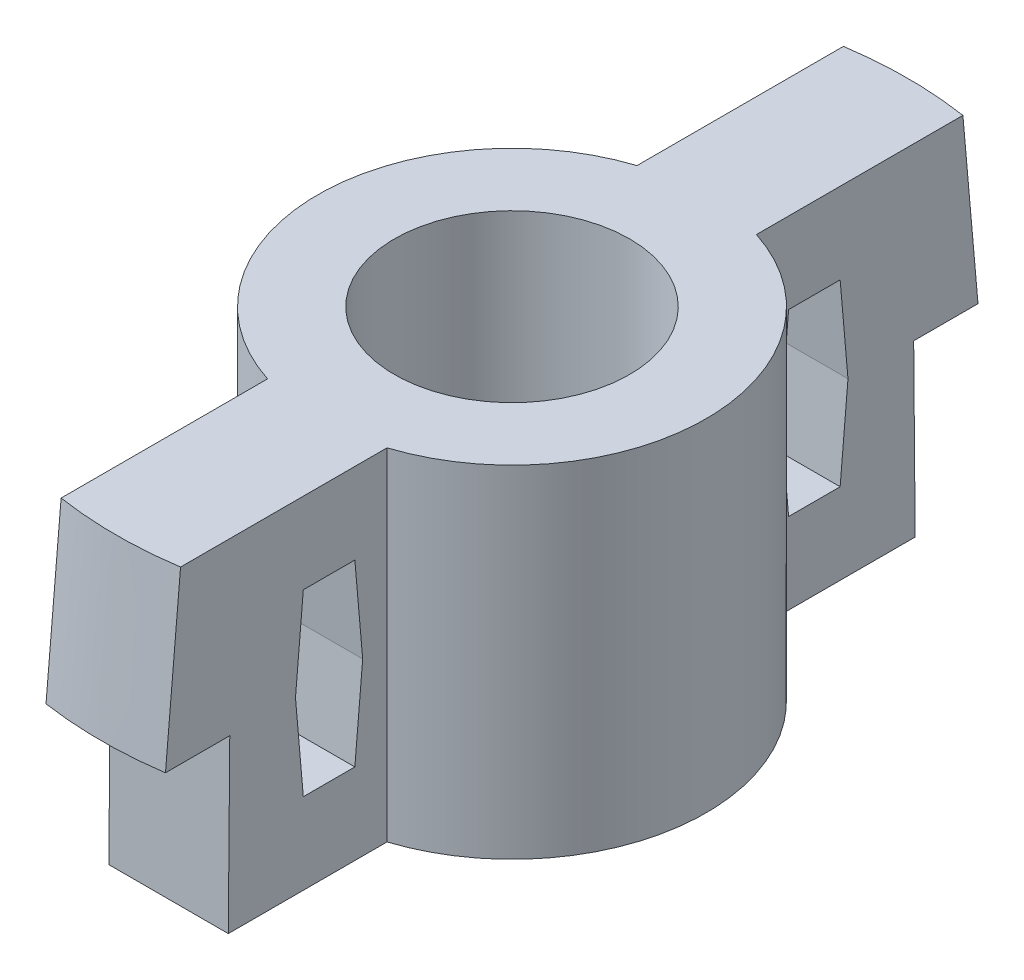
ISO-10303-21;
HEADER;
FILE_DESCRIPTION(('STEP AP214'),'2;1');
FILE_NAME('part.step','',(''),(''),'','','');
FILE_SCHEMA(('AUTOMOTIVE_DESIGN { 1 0 10303 214 1 1 1 1 }'));
ENDSEC;
DATA;
#1=APPLICATION_CONTEXT('core data for automotive mechanical design processes');
#2=APPLICATION_PROTOCOL_DEFINITION('international standard','automotive_design',2000,#1);
#3=PRODUCT_CONTEXT('',#1,'mechanical');
#4=PRODUCT('Part','Part','',(#3));
#5=PRODUCT_RELATED_PRODUCT_CATEGORY('part','',(#4));
#6=PRODUCT_DEFINITION_FORMATION('','',#4);
#7=PRODUCT_DEFINITION_CONTEXT('part definition',#1,'design');
#8=PRODUCT_DEFINITION('design','',#6,#7);
#9=PRODUCT_DEFINITION_SHAPE('','',#8);
#10=(LENGTH_UNIT() NAMED_UNIT(*) SI_UNIT(.MILLI.,.METRE.));
#11=(NAMED_UNIT(*) PLANE_ANGLE_UNIT() SI_UNIT($,.RADIAN.));
#12=(NAMED_UNIT(*) SI_UNIT($,.STERADIAN.) SOLID_ANGLE_UNIT());
#13=UNCERTAINTY_MEASURE_WITH_UNIT(LENGTH_MEASURE(1.E-05),#10,'distance_accuracy_value','');
#14=(GEOMETRIC_REPRESENTATION_CONTEXT(3) GLOBAL_UNCERTAINTY_ASSIGNED_CONTEXT((#13)) GLOBAL_UNIT_ASSIGNED_CONTEXT((#10,
#11,#12)) REPRESENTATION_CONTEXT('',''));
#15=CARTESIAN_POINT('',(0.,0.,0.));
#16=DIRECTION('',(0.,0.,1.));
#17=DIRECTION('',(1.,0.,0.));
#18=AXIS2_PLACEMENT_3D('',#15,#16,#17);
#19=CARTESIAN_POINT('',(-2.6,1.2,-2.90498639623111));
#20=DIRECTION('',(0.,1.,0.));
#21=DIRECTION('',(0.,0.,1.));
#22=AXIS2_PLACEMENT_3D('',#19,#20,#21);
#23=PLANE('',#22);
#24=DIRECTION('',(1.,0.,0.));
#25=VECTOR('',#24,1.);
#26=CARTESIAN_POINT('',(-2.6,1.2,-2.90498639623111));
#27=LINE('',#26,#25);
#28=CARTESIAN_POINT('',(0.800000000000001,1.2,-2.90498639623111));
#29=VERTEX_POINT('',#28);
#30=CARTESIAN_POINT('',(-0.799999999999999,1.2,-2.90498639623111));
#31=VERTEX_POINT('',#30);
#32=EDGE_CURVE('E179',#29,#31,#27,.F.);
#33=ORIENTED_EDGE('',*,*,#32,.T.);
#34=DIRECTION('',(0.,0.,1.));
#35=VECTOR('',#34,1.);
#36=CARTESIAN_POINT('',(-0.799999999999999,1.2,-2.90498639623111));
#37=LINE('',#36,#35);
#38=CARTESIAN_POINT('',(-0.799999999999999,1.2,-3.59501360376889));
#39=VERTEX_POINT('',#38);
#40=EDGE_CURVE('E174',#39,#31,#37,.T.);
#41=ORIENTED_EDGE('',*,*,#40,.F.);
#42=DIRECTION('',(1.,0.,0.));
#43=VECTOR('',#42,1.);
#44=CARTESIAN_POINT('',(-2.6,1.2,-3.59501360376889));
#45=LINE('',#44,#43);
#46=CARTESIAN_POINT('',(0.800000000000003,1.2,-3.59501360376889));
#47=VERTEX_POINT('',#46);
#48=EDGE_CURVE('E176',#39,#47,#45,.T.);
#49=ORIENTED_EDGE('',*,*,#48,.T.);
#50=DIRECTION('',(0.,0.,-1.));
#51=VECTOR('',#50,1.);
#52=CARTESIAN_POINT('',(0.800000000000001,1.2,-5.44150714416512));
#53=LINE('',#52,#51);
#54=EDGE_CURVE('E252',#29,#47,#53,.T.);
#55=ORIENTED_EDGE('',*,*,#54,.F.);
#56=EDGE_LOOP('',(#33,#41,#49,#55));
#57=FACE_BOUND('',#56,.T.);
#58=ADVANCED_FACE('F16',(#57),#23,.F.);
#59=CARTESIAN_POINT('',(-2.6,-1.2,-2.90498639623111));
#60=DIRECTION('',(0.,-1.,0.));
#61=DIRECTION('',(0.,0.,-1.));
#62=AXIS2_PLACEMENT_3D('',#59,#60,#61);
#63=PLANE('',#62);
#64=DIRECTION('',(1.,0.,0.));
#65=VECTOR('',#64,1.);
#66=CARTESIAN_POINT('',(-2.6,-1.2,-3.59501360376889));
#67=LINE('',#66,#65);
#68=CARTESIAN_POINT('',(0.800000000000002,-1.2,-3.59501360376889));
#69=VERTEX_POINT('',#68);
#70=CARTESIAN_POINT('',(-0.799999999999999,-1.2,-3.59501360376889));
#71=VERTEX_POINT('',#70);
#72=EDGE_CURVE('E220',#69,#71,#67,.F.);
#73=ORIENTED_EDGE('',*,*,#72,.T.);
#74=DIRECTION('',(0.,0.,-1.));
#75=VECTOR('',#74,1.);
#76=CARTESIAN_POINT('',(-0.799999999999999,-1.2,-2.90498639623111));
#77=LINE('',#76,#75);
#78=CARTESIAN_POINT('',(-0.799999999999999,-1.2,-2.90498639623111));
#79=VERTEX_POINT('',#78);
#80=EDGE_CURVE('E184',#79,#71,#77,.T.);
#81=ORIENTED_EDGE('',*,*,#80,.F.);
#82=DIRECTION('',(1.,0.,0.));
#83=VECTOR('',#82,1.);
#84=CARTESIAN_POINT('',(-2.6,-1.2,-2.90498639623111));
#85=LINE('',#84,#83);
#86=CARTESIAN_POINT('',(0.800000000000001,-1.2,-2.90498639623111));
#87=VERTEX_POINT('',#86);
#88=EDGE_CURVE('E225',#79,#87,#85,.T.);
#89=ORIENTED_EDGE('',*,*,#88,.T.);
#90=DIRECTION('',(0.,0.,-1.));
#91=VECTOR('',#90,1.);
#92=CARTESIAN_POINT('',(0.800000000000001,-1.2,-2.90498639623111));
#93=LINE('',#92,#91);
#94=EDGE_CURVE('E278',#69,#87,#93,.F.);
#95=ORIENTED_EDGE('',*,*,#94,.F.);
#96=EDGE_LOOP('',(#73,#81,#89,#95));
#97=FACE_BOUND('',#96,.T.);
#98=ADVANCED_FACE('F651',(#97),#63,.F.);
#99=CARTESIAN_POINT('',(-2.6,-1.2,2.90498639623111));
#100=DIRECTION('',(0.,-1.,0.));
#101=DIRECTION('',(0.,0.,-1.));
#102=AXIS2_PLACEMENT_3D('',#99,#100,#101);
#103=PLANE('',#102);
#104=DIRECTION('',(1.,0.,0.));
#105=VECTOR('',#104,1.);
#106=CARTESIAN_POINT('',(-2.6,-1.2,3.59501360376889));
#107=LINE('',#106,#105);
#108=CARTESIAN_POINT('',(-0.799999999999999,-1.2,3.59501360376889));
#109=VERTEX_POINT('',#108);
#110=CARTESIAN_POINT('',(0.800000000000001,-1.2,3.59501360376889));
#111=VERTEX_POINT('',#110);
#112=EDGE_CURVE('E260',#109,#111,#107,.T.);
#113=ORIENTED_EDGE('',*,*,#112,.T.);
#114=DIRECTION('',(0.,0.,-1.));
#115=VECTOR('',#114,1.);
#116=CARTESIAN_POINT('',(0.800000000000001,-1.2,2.4738633753706));
#117=LINE('',#116,#115);
#118=CARTESIAN_POINT('',(0.800000000000001,-1.2,2.90498639623111));
#119=VERTEX_POINT('',#118);
#120=EDGE_CURVE('E270',#119,#111,#117,.F.);
#121=ORIENTED_EDGE('',*,*,#120,.F.);
#122=DIRECTION('',(1.,0.,0.));
#123=VECTOR('',#122,1.);
#124=CARTESIAN_POINT('',(-2.6,-1.2,2.90498639623111));
#125=LINE('',#124,#123);
#126=CARTESIAN_POINT('',(-0.799999999999998,-1.2,2.90498639623111));
#127=VERTEX_POINT('',#126);
#128=EDGE_CURVE('E294',#119,#127,#125,.F.);
#129=ORIENTED_EDGE('',*,*,#128,.T.);
#130=DIRECTION('',(0.,0.,-1.));
#131=VECTOR('',#130,1.);
#132=CARTESIAN_POINT('',(-0.799999999999999,-1.2,2.90498639623111));
#133=LINE('',#132,#131);
#134=EDGE_CURVE('E256',#109,#127,#133,.T.);
#135=ORIENTED_EDGE('',*,*,#134,.F.);
#136=EDGE_LOOP('',(#113,#121,#129,#135));
#137=FACE_BOUND('',#136,.T.);
#138=ADVANCED_FACE('F604',(#137),#103,.F.);
#139=CARTESIAN_POINT('',(-2.6,1.2,2.90498639623111));
#140=DIRECTION('',(0.,1.,0.));
#141=DIRECTION('',(0.,0.,1.));
#142=AXIS2_PLACEMENT_3D('',#139,#140,#141);
#143=PLANE('',#142);
#144=DIRECTION('',(1.,0.,0.));
#145=VECTOR('',#144,1.);
#146=CARTESIAN_POINT('',(-2.6,1.2,2.90498639623111));
#147=LINE('',#146,#145);
#148=CARTESIAN_POINT('',(-0.799999999999999,1.2,2.90498639623111));
#149=VERTEX_POINT('',#148);
#150=CARTESIAN_POINT('',(0.800000000000001,1.2,2.90498639623111));
#151=VERTEX_POINT('',#150);
#152=EDGE_CURVE('E305',#149,#151,#147,.T.);
#153=ORIENTED_EDGE('',*,*,#152,.T.);
#154=DIRECTION('',(0.,0.,-1.));
#155=VECTOR('',#154,1.);
#156=CARTESIAN_POINT('',(0.800000000000001,1.2,2.4738633753706));
#157=LINE('',#156,#155);
#158=CARTESIAN_POINT('',(0.800000000000002,1.2,3.59501360376889));
#159=VERTEX_POINT('',#158);
#160=EDGE_CURVE('E249',#159,#151,#157,.T.);
#161=ORIENTED_EDGE('',*,*,#160,.F.);
#162=DIRECTION('',(1.,0.,0.));
#163=VECTOR('',#162,1.);
#164=CARTESIAN_POINT('',(-2.6,1.2,3.59501360376889));
#165=LINE('',#164,#163);
#166=CARTESIAN_POINT('',(-0.799999999999999,1.2,3.59501360376889));
#167=VERTEX_POINT('',#166);
#168=EDGE_CURVE('E266',#159,#167,#165,.F.);
#169=ORIENTED_EDGE('',*,*,#168,.T.);
#170=DIRECTION('',(0.,0.,1.));
#171=VECTOR('',#170,1.);
#172=CARTESIAN_POINT('',(-0.799999999999999,1.2,2.90498639623111));
#173=LINE('',#172,#171);
#174=EDGE_CURVE('E253',#149,#167,#173,.T.);
#175=ORIENTED_EDGE('',*,*,#174,.F.);
#176=EDGE_LOOP('',(#153,#161,#169,#175));
#177=FACE_BOUND('',#176,.T.);
#178=ADVANCED_FACE('F409',(#177),#143,.F.);
#179=CARTESIAN_POINT('',(0.,0.,0.));
#180=DIRECTION('',(0.,-1.,0.));
#181=DIRECTION('',(0.,0.,-1.));
#182=AXIS2_PLACEMENT_3D('',#179,#180,#181);
#183=CONICAL_SURFACE('',#182,5.49999999999784,0.0872664625997371);
#184=CARTESIAN_POINT('',(-0.799999999999999,2.28600000000513,-5.23927568475623));
#185=CARTESIAN_POINT('',(-0.799999999999999,1.90500122991337,-5.27299483076161));
#186=CARTESIAN_POINT('',(-0.799999999999999,1.52400184486587,-5.30670702538162));
#187=CARTESIAN_POINT('',(-0.799999999999999,0.762001844864109,-5.37411751185053));
#188=CARTESIAN_POINT('',(-0.799999999999999,0.381001229909845,-5.40781580369941));
#189=CARTESIAN_POINT('',(-0.799999999999999,-1.52787799459702E-13,-5.44150714416295));
#190=B_SPLINE_CURVE_WITH_KNOTS('',3,(#184,#185,#186,#187,#188,#189),.UNSPECIFIED.,.F.,.F.,(4,2,
4),(0.,1.14746389540325,2.29492779079236),.UNSPECIFIED.);
#191=CARTESIAN_POINT('',(-0.799999999999999,2.28600000001578,-5.23927568475529));
#192=VERTEX_POINT('',#191);
#193=CARTESIAN_POINT('',(-0.799999999999999,0.,-5.44150714416293));
#194=VERTEX_POINT('',#193);
#195=EDGE_CURVE('E206',#192,#194,#190,.T.);
#196=ORIENTED_EDGE('',*,*,#195,.F.);
#197=CARTESIAN_POINT('',(0.,2.28600000002643,0.));
#198=DIRECTION('',(0.,-1.,0.));
#199=DIRECTION('',(0.,0.,-1.));
#200=AXIS2_PLACEMENT_3D('',#197,#198,#199);
#201=CIRCLE('',#200,5.30000091517522);
#202=CARTESIAN_POINT('',(0.800000000000001,2.28600000002107,-5.23927568475482));
#203=VERTEX_POINT('',#202);
#204=EDGE_CURVE('E469',#203,#192,#201,.F.);
#205=ORIENTED_EDGE('',*,*,#204,.F.);
#206=CARTESIAN_POINT('',(0.800000000000001,2.2860000000157,-5.2392756847553));
#207=CARTESIAN_POINT('',(0.800000000000001,1.90500122992219,-5.27299483076083));
#208=CARTESIAN_POINT('',(0.800000000000001,1.52400184487294,-5.306707025381));
#209=CARTESIAN_POINT('',(0.800000000000001,0.762001844867683,-5.37411751185021));
#210=CARTESIAN_POINT('',(0.800000000000001,0.381001229911669,-5.40781580369925));
#211=CARTESIAN_POINT('',(0.800000000000001,0.,-5.44150714416294));
#212=B_SPLINE_CURVE_WITH_KNOTS('',3,(#206,#207,#208,#209,#210,#211),.UNSPECIFIED.,.F.,.F.,(4,2,
4),(0.,1.14746389540853,2.2949277908029),.UNSPECIFIED.);
#213=CARTESIAN_POINT('',(0.800000000000001,0.,-5.44150714416294));
#214=VERTEX_POINT('',#213);
#215=EDGE_CURVE('E246',#203,#214,#212,.T.);
#216=ORIENTED_EDGE('',*,*,#215,.T.);
#217=CARTESIAN_POINT('',(0.,0.,0.));
#218=DIRECTION('',(0.,-1.,0.));
#219=DIRECTION('',(0.,0.,-1.));
#220=AXIS2_PLACEMENT_3D('',#217,#218,#219);
#221=CIRCLE('',#220,5.49999999999784);
#222=EDGE_CURVE('E193',#214,#194,#221,.F.);
#223=ORIENTED_EDGE('',*,*,#222,.T.);
#224=EDGE_LOOP('',(#196,#205,#216,#223));
#225=FACE_BOUND('',#224,.T.);
#226=ADVANCED_FACE('F403',(#225),#183,.T.);
#227=CARTESIAN_POINT('',(-2.6,0.,-4.58005129541007));
#228=DIRECTION('',(0.,1.,0.));
#229=DIRECTION('',(0.,0.,1.));
#230=AXIS2_PLACEMENT_3D('',#227,#228,#229);
#231=PLANE('',#230);
#232=ORIENTED_EDGE('',*,*,#222,.F.);
#233=DIRECTION('',(0.,0.,1.));
#234=VECTOR('',#233,1.);
#235=CARTESIAN_POINT('',(0.800000000000001,0.,-4.58005129541007));
#236=LINE('',#235,#234);
#237=CARTESIAN_POINT('',(0.800000000000002,0.,-4.58005129541007));
#238=VERTEX_POINT('',#237);
#239=EDGE_CURVE('E244',#238,#214,#236,.F.);
#240=ORIENTED_EDGE('',*,*,#239,.F.);
#241=DIRECTION('',(1.,0.,0.));
#242=VECTOR('',#241,1.);
#243=CARTESIAN_POINT('',(-2.6,0.,-4.58005129541007));
#244=LINE('',#243,#242);
#245=CARTESIAN_POINT('',(-0.799999999999999,0.,-4.58005129541007));
#246=VERTEX_POINT('',#245);
#247=EDGE_CURVE('E219',#238,#246,#244,.F.);
#248=ORIENTED_EDGE('',*,*,#247,.T.);
#249=DIRECTION('',(0.,0.,1.));
#250=VECTOR('',#249,1.);
#251=CARTESIAN_POINT('',(-0.799999999999999,0.,-5.44150714416512));
#252=LINE('',#251,#250);
#253=EDGE_CURVE('E201',#194,#246,#252,.T.);
#254=ORIENTED_EDGE('',*,*,#253,.F.);
#255=EDGE_LOOP('',(#232,#240,#248,#254));
#256=FACE_BOUND('',#255,.T.);
#257=ADVANCED_FACE('F408',(#256),#231,.F.);
#258=CARTESIAN_POINT('',(-2.6,1.2,-3.59501360376889));
#259=DIRECTION('',(0.,0.0871557427476621,-0.996194698091745));
#260=DIRECTION('',(0.,0.996194698091745,0.0871557427476621));
#261=AXIS2_PLACEMENT_3D('',#258,#259,#260);
#262=PLANE('',#261);
#263=ORIENTED_EDGE('',*,*,#48,.F.);
#264=DIRECTION('',(0.,0.996194698091745,0.0871557427476621));
#265=VECTOR('',#264,1.);
#266=CARTESIAN_POINT('',(-0.799999999999999,0.,-3.7));
#267=LINE('',#266,#265);
#268=CARTESIAN_POINT('',(-0.799999999999998,0.,-3.7));
#269=VERTEX_POINT('',#268);
#270=EDGE_CURVE('E190',#269,#39,#267,.T.);
#271=ORIENTED_EDGE('',*,*,#270,.F.);
#272=DIRECTION('',(1.,0.,0.));
#273=VECTOR('',#272,1.);
#274=CARTESIAN_POINT('',(-2.6,0.,-3.7));
#275=LINE('',#274,#273);
#276=CARTESIAN_POINT('',(0.800000000000002,0.,-3.7));
#277=VERTEX_POINT('',#276);
#278=EDGE_CURVE('E217',#269,#277,#275,.T.);
#279=ORIENTED_EDGE('',*,*,#278,.T.);
#280=DIRECTION('',(0.,0.996194698091745,0.0871557427476621));
#281=VECTOR('',#280,1.);
#282=CARTESIAN_POINT('',(0.800000000000003,1.2,-3.59501360376889));
#283=LINE('',#282,#281);
#284=EDGE_CURVE('E192',#47,#277,#283,.F.);
#285=ORIENTED_EDGE('',*,*,#284,.F.);
#286=EDGE_LOOP('',(#263,#271,#279,#285));
#287=FACE_BOUND('',#286,.T.);
#288=ADVANCED_FACE('F188',(#287),#262,.F.);
#289=CARTESIAN_POINT('',(-2.6,0.,-2.8));
#290=DIRECTION('',(0.,0.087155742747661,0.996194698091745));
#291=DIRECTION('',(0.,-0.996194698091745,0.087155742747661));
#292=AXIS2_PLACEMENT_3D('',#289,#290,#291);
#293=PLANE('',#292);
#294=DIRECTION('',(1.,0.,0.));
#295=VECTOR('',#294,1.);
#296=CARTESIAN_POINT('',(-2.6,0.,-2.8));
#297=LINE('',#296,#295);
#298=CARTESIAN_POINT('',(0.800000000000001,0.,-2.8));
#299=VERTEX_POINT('',#298);
#300=CARTESIAN_POINT('',(-0.799999999999999,0.,-2.8));
#301=VERTEX_POINT('',#300);
#302=EDGE_CURVE('E234',#299,#301,#297,.F.);
#303=ORIENTED_EDGE('',*,*,#302,.T.);
#304=DIRECTION('',(0.,-0.996194698091745,0.087155742747661));
#305=VECTOR('',#304,1.);
#306=CARTESIAN_POINT('',(-0.799999999999999,1.2,-2.90498639623111));
#307=LINE('',#306,#305);
#308=EDGE_CURVE('E200',#31,#301,#307,.T.);
#309=ORIENTED_EDGE('',*,*,#308,.F.);
#310=ORIENTED_EDGE('',*,*,#32,.F.);
#311=DIRECTION('',(0.,-0.996194698091745,0.087155742747661));
#312=VECTOR('',#311,1.);
#313=CARTESIAN_POINT('',(0.800000000000001,0.,-2.8));
#314=LINE('',#313,#312);
#315=EDGE_CURVE('E236',#299,#29,#314,.F.);
#316=ORIENTED_EDGE('',*,*,#315,.F.);
#317=EDGE_LOOP('',(#303,#309,#310,#316));
#318=FACE_BOUND('',#317,.T.);
#319=ADVANCED_FACE('F624',(#318),#293,.F.);
#320=CARTESIAN_POINT('',(-2.6,0.,-2.8));
#321=DIRECTION('',(0.,-0.087155742747661,0.996194698091745));
#322=DIRECTION('',(0.,-0.996194698091745,-0.087155742747661));
#323=AXIS2_PLACEMENT_3D('',#320,#321,#322);
#324=PLANE('',#323);
#325=ORIENTED_EDGE('',*,*,#88,.F.);
#326=DIRECTION('',(0.,-0.996194698091745,-0.087155742747661));
#327=VECTOR('',#326,1.);
#328=CARTESIAN_POINT('',(-0.799999999999999,0.,-2.8));
#329=LINE('',#328,#327);
#330=EDGE_CURVE('E203',#301,#79,#329,.T.);
#331=ORIENTED_EDGE('',*,*,#330,.F.);
#332=ORIENTED_EDGE('',*,*,#302,.F.);
#333=DIRECTION('',(0.,0.996194698091745,0.087155742747661));
#334=VECTOR('',#333,1.);
#335=CARTESIAN_POINT('',(0.800000000000001,-1.2,-2.90498639623111));
#336=LINE('',#335,#334);
#337=EDGE_CURVE('E281',#87,#299,#336,.T.);
#338=ORIENTED_EDGE('',*,*,#337,.F.);
#339=EDGE_LOOP('',(#325,#331,#332,#338));
#340=FACE_BOUND('',#339,.T.);
#341=ADVANCED_FACE('F620',(#340),#324,.F.);
#342=CARTESIAN_POINT('',(-2.6,-1.2,-3.59501360376889));
#343=DIRECTION('',(0.,-0.0871557427476617,-0.996194698091745));
#344=DIRECTION('',(0.,0.996194698091745,-0.0871557427476617));
#345=AXIS2_PLACEMENT_3D('',#342,#343,#344);
#346=PLANE('',#345);
#347=ORIENTED_EDGE('',*,*,#278,.F.);
#348=DIRECTION('',(0.,0.996194698091745,-0.0871557427476614));
#349=VECTOR('',#348,1.);
#350=CARTESIAN_POINT('',(-0.799999999999999,-1.2,-3.59501360376889));
#351=LINE('',#350,#349);
#352=EDGE_CURVE('E199',#71,#269,#351,.T.);
#353=ORIENTED_EDGE('',*,*,#352,.F.);
#354=ORIENTED_EDGE('',*,*,#72,.F.);
#355=DIRECTION('',(0.,-0.996194698091745,0.0871557427476614));
#356=VECTOR('',#355,1.);
#357=CARTESIAN_POINT('',(0.800000000000001,0.,-3.7));
#358=LINE('',#357,#356);
#359=EDGE_CURVE('E285',#277,#69,#358,.T.);
#360=ORIENTED_EDGE('',*,*,#359,.F.);
#361=EDGE_LOOP('',(#347,#353,#354,#360));
#362=FACE_BOUND('',#361,.T.);
#363=ADVANCED_FACE('F614',(#362),#346,.F.);
#364=CARTESIAN_POINT('',(-2.6,-2.286,-4.60000091517974));
#365=DIRECTION('',(0.,-0.00872653549836949,0.999961923064171));
#366=DIRECTION('',(0.,-0.999961923064171,-0.00872653549836949));
#367=AXIS2_PLACEMENT_3D('',#364,#365,#366);
#368=PLANE('',#367);
#369=DIRECTION('',(1.,0.,0.));
#370=VECTOR('',#369,1.);
#371=CARTESIAN_POINT('',(-2.6,-2.286,-4.60000091517974));
#372=LINE('',#371,#370);
#373=CARTESIAN_POINT('',(-0.799999999999998,-2.286,-4.60000091517974));
#374=VERTEX_POINT('',#373);
#375=CARTESIAN_POINT('',(0.800000000000002,-2.286,-4.60000091517974));
#376=VERTEX_POINT('',#375);
#377=EDGE_CURVE('E274',#374,#376,#372,.T.);
#378=ORIENTED_EDGE('',*,*,#377,.F.);
#379=DIRECTION('',(0.,-0.999961923064171,-0.00872653549836949));
#380=VECTOR('',#379,1.);
#381=CARTESIAN_POINT('',(-0.799999999999999,0.,-4.58005129541007));
#382=LINE('',#381,#380);
#383=EDGE_CURVE('E214',#246,#374,#382,.T.);
#384=ORIENTED_EDGE('',*,*,#383,.F.);
#385=ORIENTED_EDGE('',*,*,#247,.F.);
#386=DIRECTION('',(0.,0.999961923064171,0.00872653549836949));
#387=VECTOR('',#386,1.);
#388=CARTESIAN_POINT('',(0.800000000000001,-2.286,-4.60000091517974));
#389=LINE('',#388,#387);
#390=EDGE_CURVE('E317',#376,#238,#389,.T.);
#391=ORIENTED_EDGE('',*,*,#390,.F.);
#392=EDGE_LOOP('',(#378,#384,#385,#391));
#393=FACE_BOUND('',#392,.T.);
#394=ADVANCED_FACE('F539',(#393),#368,.F.);
#395=CARTESIAN_POINT('',(0.800000000000001,-5.7090838247001,2.4738633753706));
#396=DIRECTION('',(1.,0.,0.));
#397=DIRECTION('',(0.,0.,-1.));
#398=AXIS2_PLACEMENT_3D('',#395,#396,#397);
#399=PLANE('',#398);
#400=DIRECTION('',(0.,0.996194698091745,0.0871557427476606));
#401=VECTOR('',#400,1.);
#402=CARTESIAN_POINT('',(0.800000000000001,0.,2.8));
#403=LINE('',#402,#401);
#404=CARTESIAN_POINT('',(0.800000000000002,0.,2.8));
#405=VERTEX_POINT('',#404);
#406=EDGE_CURVE('E302',#151,#405,#403,.F.);
#407=ORIENTED_EDGE('',*,*,#406,.T.);
#408=DIRECTION('',(0.,0.996194698091745,-0.0871557427476603));
#409=VECTOR('',#408,1.);
#410=CARTESIAN_POINT('',(0.800000000000003,0.,2.8));
#411=LINE('',#410,#409);
#412=EDGE_CURVE('E259',#405,#119,#411,.F.);
#413=ORIENTED_EDGE('',*,*,#412,.T.);
#414=ORIENTED_EDGE('',*,*,#120,.T.);
#415=DIRECTION('',(0.,-0.996194698091745,-0.0871557427476624));
#416=VECTOR('',#415,1.);
#417=CARTESIAN_POINT('',(0.800000000000001,-1.2,3.59501360376889));
#418=LINE('',#417,#416);
#419=CARTESIAN_POINT('',(0.800000000000002,0.,3.7));
#420=VERTEX_POINT('',#419);
#421=EDGE_CURVE('E257',#111,#420,#418,.F.);
#422=ORIENTED_EDGE('',*,*,#421,.T.);
#423=DIRECTION('',(0.,-0.996194698091745,0.0871557427476621));
#424=VECTOR('',#423,1.);
#425=CARTESIAN_POINT('',(0.800000000000003,1.2,3.59501360376889));
#426=LINE('',#425,#424);
#427=EDGE_CURVE('E263',#420,#159,#426,.F.);
#428=ORIENTED_EDGE('',*,*,#427,.T.);
#429=ORIENTED_EDGE('',*,*,#160,.T.);
#430=EDGE_LOOP('',(#407,#413,#414,#422,#428,#429));
#431=FACE_BOUND('',#430,.T.);
#432=DIRECTION('',(0.,0.999961923064171,-0.00872653549836949));
#433=VECTOR('',#432,1.);
#434=CARTESIAN_POINT('',(0.800000000000003,-2.286,4.60000091517974));
#435=LINE('',#434,#433);
#436=CARTESIAN_POINT('',(0.800000000000002,0.,4.58005129541007));
#437=VERTEX_POINT('',#436);
#438=CARTESIAN_POINT('',(0.800000000000002,-2.286,4.60000091517974));
#439=VERTEX_POINT('',#438);
#440=EDGE_CURVE('E106',#437,#439,#435,.F.);
#441=ORIENTED_EDGE('',*,*,#440,.T.);
#442=DIRECTION('',(0.,0.,1.));
#443=VECTOR('',#442,1.);
#444=CARTESIAN_POINT('',(0.800000000000001,-2.286,0.));
#445=LINE('',#444,#443);
#446=CARTESIAN_POINT('',(0.800000000000001,-2.286,2.4738633753706));
#447=VERTEX_POINT('',#446);
#448=EDGE_CURVE('E499',#439,#447,#445,.F.);
#449=ORIENTED_EDGE('',*,*,#448,.T.);
#450=DIRECTION('',(0.,-1.,0.));
#451=VECTOR('',#450,1.);
#452=CARTESIAN_POINT('',(0.800000000000001,2.286,2.4738633753706));
#453=LINE('',#452,#451);
#454=CARTESIAN_POINT('',(0.800000000000001,2.286,2.4738633753706));
#455=VERTEX_POINT('',#454);
#456=EDGE_CURVE('E273',#455,#447,#453,.T.);
#457=ORIENTED_EDGE('',*,*,#456,.F.);
#458=DIRECTION('',(0.,0.,1.));
#459=VECTOR('',#458,1.);
#460=CARTESIAN_POINT('',(0.800000000000001,2.286,0.));
#461=LINE('',#460,#459);
#462=CARTESIAN_POINT('',(0.800000000000001,2.28600000001578,5.23927568475529));
#463=VERTEX_POINT('',#462);
#464=EDGE_CURVE('E465',#463,#455,#461,.F.);
#465=ORIENTED_EDGE('',*,*,#464,.F.);
#466=CARTESIAN_POINT('',(0.800000000000001,2.28600000000513,5.23927568475623));
#467=CARTESIAN_POINT('',(0.800000000000001,1.90500122991336,5.27299483076161));
#468=CARTESIAN_POINT('',(0.800000000000001,1.52400184486587,5.30670702538162));
#469=CARTESIAN_POINT('',(0.800000000000001,0.762001844864108,5.37411751185053));
#470=CARTESIAN_POINT('',(0.800000000000001,0.381001229909843,5.40781580369942));
#471=CARTESIAN_POINT('',(0.800000000000001,-1.54846269984752E-13,5.44150714416295));
#472=B_SPLINE_CURVE_WITH_KNOTS('',3,(#466,#467,#468,#469,#470,#471),.UNSPECIFIED.,.F.,.F.,(4,2,
4),(0.,1.14746389540326,2.29492779079236),.UNSPECIFIED.);
#473=CARTESIAN_POINT('',(0.800000000000001,0.,5.44150714416294));
#474=VERTEX_POINT('',#473);
#475=EDGE_CURVE('E19',#463,#474,#472,.T.);
#476=ORIENTED_EDGE('',*,*,#475,.T.);
#477=DIRECTION('',(0.,0.,1.));
#478=VECTOR('',#477,1.);
#479=CARTESIAN_POINT('',(0.800000000000001,0.,4.58005129541007));
#480=LINE('',#479,#478);
#481=EDGE_CURVE('E474',#474,#437,#480,.F.);
#482=ORIENTED_EDGE('',*,*,#481,.T.);
#483=EDGE_LOOP('',(#441,#449,#457,#465,#476,#482));
#484=FACE_BOUND('',#483,.T.);
#485=ADVANCED_FACE('F577',(#431,#484),#399,.T.);
#486=CARTESIAN_POINT('',(0.,2.286,0.));
#487=DIRECTION('',(0.,-1.,0.));
#488=DIRECTION('',(0.,0.,-1.));
#489=AXIS2_PLACEMENT_3D('',#486,#487,#488);
#490=CYLINDRICAL_SURFACE('',#489,2.6);
#491=CARTESIAN_POINT('',(0.,2.286,0.));
#492=DIRECTION('',(0.,-1.,0.));
#493=DIRECTION('',(0.,0.,-1.));
#494=AXIS2_PLACEMENT_3D('',#491,#492,#493);
#495=CIRCLE('',#494,2.6);
#496=CARTESIAN_POINT('',(0.800000000000001,2.286,-2.4738633753706));
#497=VERTEX_POINT('',#496);
#498=EDGE_CURVE('E564',#455,#497,#495,.F.);
#499=ORIENTED_EDGE('',*,*,#498,.F.);
#500=ORIENTED_EDGE('',*,*,#456,.T.);
#501=CARTESIAN_POINT('',(0.,-2.286,0.));
#502=DIRECTION('',(0.,-1.,0.));
#503=DIRECTION('',(0.,0.,-1.));
#504=AXIS2_PLACEMENT_3D('',#501,#502,#503);
#505=CIRCLE('',#504,2.6);
#506=CARTESIAN_POINT('',(0.800000000000001,-2.286,-2.4738633753706));
#507=VERTEX_POINT('',#506);
#508=EDGE_CURVE('E422',#447,#507,#505,.F.);
#509=ORIENTED_EDGE('',*,*,#508,.T.);
#510=DIRECTION('',(0.,1.,0.));
#511=VECTOR('',#510,1.);
#512=CARTESIAN_POINT('',(0.800000000000001,-5.7090838247001,-2.4738633753706));
#513=LINE('',#512,#511);
#514=EDGE_CURVE('E284',#497,#507,#513,.F.);
#515=ORIENTED_EDGE('',*,*,#514,.F.);
#516=EDGE_LOOP('',(#499,#500,#509,#515));
#517=FACE_BOUND('',#516,.T.);
#518=ADVANCED_FACE('F394',(#517),#490,.T.);
#519=CARTESIAN_POINT('',(0.800000000000001,-5.7090838247001,-5.44150714416512));
#520=DIRECTION('',(1.,0.,0.));
#521=DIRECTION('',(0.,0.,-1.));
#522=AXIS2_PLACEMENT_3D('',#519,#520,#521);
#523=PLANE('',#522);
#524=ORIENTED_EDGE('',*,*,#284,.T.);
#525=ORIENTED_EDGE('',*,*,#359,.T.);
#526=ORIENTED_EDGE('',*,*,#94,.T.);
#527=ORIENTED_EDGE('',*,*,#337,.T.);
#528=ORIENTED_EDGE('',*,*,#315,.T.);
#529=ORIENTED_EDGE('',*,*,#54,.T.);
#530=EDGE_LOOP('',(#524,#525,#526,#527,#528,#529));
#531=FACE_BOUND('',#530,.T.);
#532=ORIENTED_EDGE('',*,*,#514,.T.);
#533=DIRECTION('',(0.,0.,1.));
#534=VECTOR('',#533,1.);
#535=CARTESIAN_POINT('',(0.800000000000001,-2.286,0.));
#536=LINE('',#535,#534);
#537=EDGE_CURVE('E543',#507,#376,#536,.F.);
#538=ORIENTED_EDGE('',*,*,#537,.T.);
#539=ORIENTED_EDGE('',*,*,#390,.T.);
#540=ORIENTED_EDGE('',*,*,#239,.T.);
#541=ORIENTED_EDGE('',*,*,#215,.F.);
#542=DIRECTION('',(0.,0.,1.));
#543=VECTOR('',#542,1.);
#544=CARTESIAN_POINT('',(0.800000000000001,2.286,0.));
#545=LINE('',#544,#543);
#546=EDGE_CURVE('E562',#497,#203,#545,.F.);
#547=ORIENTED_EDGE('',*,*,#546,.F.);
#548=EDGE_LOOP('',(#532,#538,#539,#540,#541,#547));
#549=FACE_BOUND('',#548,.T.);
#550=ADVANCED_FACE('F389',(#531,#549),#523,.T.);
#551=CARTESIAN_POINT('',(0.,2.286,0.));
#552=DIRECTION('',(0.,-1.,0.));
#553=DIRECTION('',(0.,0.,-1.));
#554=AXIS2_PLACEMENT_3D('',#551,#552,#553);
#555=CYLINDRICAL_SURFACE('',#554,1.575);
#556=CARTESIAN_POINT('',(0.,-2.286,0.));
#557=DIRECTION('',(0.,-1.,0.));
#558=DIRECTION('',(0.,0.,-1.));
#559=AXIS2_PLACEMENT_3D('',#556,#557,#558);
#560=CIRCLE('',#559,1.575);
#561=CARTESIAN_POINT('',(0.,-2.286,-1.575));
#562=VERTEX_POINT('',#561);
#563=EDGE_CURVE('E357',#562,#562,#560,.T.);
#564=ORIENTED_EDGE('',*,*,#563,.T.);
#565=EDGE_LOOP('',(#564));
#566=FACE_BOUND('',#565,.T.);
#567=CARTESIAN_POINT('',(0.,2.286,0.));
#568=DIRECTION('',(0.,-1.,0.));
#569=DIRECTION('',(0.,0.,-1.));
#570=AXIS2_PLACEMENT_3D('',#567,#568,#569);
#571=CIRCLE('',#570,1.575);
#572=CARTESIAN_POINT('',(0.,2.286,-1.575));
#573=VERTEX_POINT('',#572);
#574=EDGE_CURVE('E423',#573,#573,#571,.T.);
#575=ORIENTED_EDGE('',*,*,#574,.F.);
#576=EDGE_LOOP('',(#575));
#577=FACE_BOUND('',#576,.T.);
#578=ADVANCED_FACE('F386',(#566,#577),#555,.F.);
#579=CARTESIAN_POINT('',(-2.6,-2.286,4.60000091517974));
#580=DIRECTION('',(0.,-0.00872653549836949,-0.999961923064171));
#581=DIRECTION('',(0.,0.999961923064171,-0.00872653549836949));
#582=AXIS2_PLACEMENT_3D('',#579,#580,#581);
#583=PLANE('',#582);
#584=DIRECTION('',(1.,0.,0.));
#585=VECTOR('',#584,1.);
#586=CARTESIAN_POINT('',(0.,-2.286,4.60000091517974));
#587=LINE('',#586,#585);
#588=CARTESIAN_POINT('',(-0.799999999999999,-2.286,4.60000091517974));
#589=VERTEX_POINT('',#588);
#590=EDGE_CURVE('E497',#589,#439,#587,.T.);
#591=ORIENTED_EDGE('',*,*,#590,.T.);
#592=ORIENTED_EDGE('',*,*,#440,.F.);
#593=DIRECTION('',(1.,0.,0.));
#594=VECTOR('',#593,1.);
#595=CARTESIAN_POINT('',(-2.6,0.,4.58005129541007));
#596=LINE('',#595,#594);
#597=CARTESIAN_POINT('',(-0.799999999999999,0.,4.58005129541007));
#598=VERTEX_POINT('',#597);
#599=EDGE_CURVE('E299',#437,#598,#596,.F.);
#600=ORIENTED_EDGE('',*,*,#599,.T.);
#601=DIRECTION('',(0.,0.999961923064171,-0.00872653549836949));
#602=VECTOR('',#601,1.);
#603=CARTESIAN_POINT('',(-0.799999999999999,-2.286,4.60000091517974));
#604=LINE('',#603,#602);
#605=EDGE_CURVE('E481',#589,#598,#604,.T.);
#606=ORIENTED_EDGE('',*,*,#605,.F.);
#607=EDGE_LOOP('',(#591,#592,#600,#606));
#608=FACE_BOUND('',#607,.T.);
#609=ADVANCED_FACE('F382',(#608),#583,.F.);
#610=CARTESIAN_POINT('',(-2.6,-1.2,3.59501360376889));
#611=DIRECTION('',(0.,-0.0871557427476624,0.996194698091745));
#612=DIRECTION('',(0.,-0.996194698091745,-0.0871557427476624));
#613=AXIS2_PLACEMENT_3D('',#610,#611,#612);
#614=PLANE('',#613);
#615=DIRECTION('',(1.,0.,0.));
#616=VECTOR('',#615,1.);
#617=CARTESIAN_POINT('',(-2.6,0.,3.7));
#618=LINE('',#617,#616);
#619=CARTESIAN_POINT('',(-0.799999999999999,0.,3.7));
#620=VERTEX_POINT('',#619);
#621=EDGE_CURVE('E267',#620,#420,#618,.T.);
#622=ORIENTED_EDGE('',*,*,#621,.T.);
#623=ORIENTED_EDGE('',*,*,#421,.F.);
#624=ORIENTED_EDGE('',*,*,#112,.F.);
#625=DIRECTION('',(0.,-0.996194698091745,-0.0871557427476628));
#626=VECTOR('',#625,1.);
#627=CARTESIAN_POINT('',(-0.799999999999999,0.,3.7));
#628=LINE('',#627,#626);
#629=EDGE_CURVE('E338',#620,#109,#628,.T.);
#630=ORIENTED_EDGE('',*,*,#629,.F.);
#631=EDGE_LOOP('',(#622,#623,#624,#630));
#632=FACE_BOUND('',#631,.T.);
#633=ADVANCED_FACE('F378',(#632),#614,.F.);
#634=CARTESIAN_POINT('',(-2.6,0.,2.8));
#635=DIRECTION('',(0.,-0.0871557427476603,-0.996194698091745));
#636=DIRECTION('',(0.,0.996194698091745,-0.0871557427476603));
#637=AXIS2_PLACEMENT_3D('',#634,#635,#636);
#638=PLANE('',#637);
#639=ORIENTED_EDGE('',*,*,#128,.F.);
#640=ORIENTED_EDGE('',*,*,#412,.F.);
#641=DIRECTION('',(1.,0.,0.));
#642=VECTOR('',#641,1.);
#643=CARTESIAN_POINT('',(-2.6,0.,2.8));
#644=LINE('',#643,#642);
#645=CARTESIAN_POINT('',(-0.799999999999999,0.,2.8));
#646=VERTEX_POINT('',#645);
#647=EDGE_CURVE('E304',#405,#646,#644,.F.);
#648=ORIENTED_EDGE('',*,*,#647,.T.);
#649=DIRECTION('',(0.,0.996194698091745,-0.0871557427476603));
#650=VECTOR('',#649,1.);
#651=CARTESIAN_POINT('',(-0.799999999999999,-1.2,2.90498639623111));
#652=LINE('',#651,#650);
#653=EDGE_CURVE('E335',#127,#646,#652,.T.);
#654=ORIENTED_EDGE('',*,*,#653,.F.);
#655=EDGE_LOOP('',(#639,#640,#648,#654));
#656=FACE_BOUND('',#655,.T.);
#657=ADVANCED_FACE('F374',(#656),#638,.F.);
#658=CARTESIAN_POINT('',(-2.6,0.,4.58005129541007));
#659=DIRECTION('',(0.,1.,0.));
#660=DIRECTION('',(0.,0.,1.));
#661=AXIS2_PLACEMENT_3D('',#658,#659,#660);
#662=PLANE('',#661);
#663=ORIENTED_EDGE('',*,*,#481,.F.);
#664=CARTESIAN_POINT('',(0.,0.,0.));
#665=DIRECTION('',(0.,-1.,0.));
#666=DIRECTION('',(0.,0.,-1.));
#667=AXIS2_PLACEMENT_3D('',#664,#665,#666);
#668=CIRCLE('',#667,5.49999999999784);
#669=CARTESIAN_POINT('',(-0.799999999999999,0.,5.44150714416294));
#670=VERTEX_POINT('',#669);
#671=EDGE_CURVE('E94',#670,#474,#668,.F.);
#672=ORIENTED_EDGE('',*,*,#671,.F.);
#673=DIRECTION('',(0.,0.,1.));
#674=VECTOR('',#673,1.);
#675=CARTESIAN_POINT('',(-0.799999999999999,0.,2.4738633753706));
#676=LINE('',#675,#674);
#677=EDGE_CURVE('E356',#598,#670,#676,.T.);
#678=ORIENTED_EDGE('',*,*,#677,.F.);
#679=ORIENTED_EDGE('',*,*,#599,.F.);
#680=EDGE_LOOP('',(#663,#672,#678,#679));
#681=FACE_BOUND('',#680,.T.);
#682=ADVANCED_FACE('F369',(#681),#662,.F.);
#683=CARTESIAN_POINT('',(0.,0.,0.));
#684=DIRECTION('',(0.,-1.,0.));
#685=DIRECTION('',(0.,0.,-1.));
#686=AXIS2_PLACEMENT_3D('',#683,#684,#685);
#687=CONICAL_SURFACE('',#686,5.49999999999784,0.0872664625997371);
#688=CARTESIAN_POINT('',(-0.799999999999999,-1.35193947920627E-13,5.44150714416295));
#689=CARTESIAN_POINT('',(-0.799999999999999,0.381001229909859,5.40781580369941));
#690=CARTESIAN_POINT('',(-0.799999999999999,0.762001844864121,5.37411751185053));
#691=CARTESIAN_POINT('',(-0.799999999999999,1.52400184486588,5.30670702538162));
#692=CARTESIAN_POINT('',(-0.799999999999999,1.90500122991337,5.27299483076161));
#693=CARTESIAN_POINT('',(-0.799999999999999,2.28600000000513,5.23927568475623));
#694=B_SPLINE_CURVE_WITH_KNOTS('',3,(#688,#689,#690,#691,#692,#693),.UNSPECIFIED.,.F.,.F.,(4,2,
4),(0.,1.1474638953891,2.29492779079234),.UNSPECIFIED.);
#695=CARTESIAN_POINT('',(-0.799999999999999,2.28600000001322,5.23927568475552));
#696=VERTEX_POINT('',#695);
#697=EDGE_CURVE('E348',#670,#696,#694,.T.);
#698=ORIENTED_EDGE('',*,*,#697,.F.);
#699=ORIENTED_EDGE('',*,*,#671,.T.);
#700=ORIENTED_EDGE('',*,*,#475,.F.);
#701=CARTESIAN_POINT('',(0.,2.28600000002643,0.));
#702=DIRECTION('',(0.,-1.,0.));
#703=DIRECTION('',(0.,0.,-1.));
#704=AXIS2_PLACEMENT_3D('',#701,#702,#703);
#705=CIRCLE('',#704,5.30000091517522);
#706=EDGE_CURVE('E569',#696,#463,#705,.F.);
#707=ORIENTED_EDGE('',*,*,#706,.F.);
#708=EDGE_LOOP('',(#698,#699,#700,#707));
#709=FACE_BOUND('',#708,.T.);
#710=ADVANCED_FACE('F363',(#709),#687,.T.);
#711=CARTESIAN_POINT('',(-2.6,0.,2.8));
#712=DIRECTION('',(0.,0.0871557427476606,-0.996194698091745));
#713=DIRECTION('',(0.,0.996194698091745,0.0871557427476606));
#714=AXIS2_PLACEMENT_3D('',#711,#712,#713);
#715=PLANE('',#714);
#716=ORIENTED_EDGE('',*,*,#647,.F.);
#717=ORIENTED_EDGE('',*,*,#406,.F.);
#718=ORIENTED_EDGE('',*,*,#152,.F.);
#719=DIRECTION('',(0.,0.996194698091745,0.0871557427476606));
#720=VECTOR('',#719,1.);
#721=CARTESIAN_POINT('',(-0.799999999999999,0.,2.8));
#722=LINE('',#721,#720);
#723=EDGE_CURVE('E459',#646,#149,#722,.T.);
#724=ORIENTED_EDGE('',*,*,#723,.F.);
#725=EDGE_LOOP('',(#716,#717,#718,#724));
#726=FACE_BOUND('',#725,.T.);
#727=ADVANCED_FACE('F368',(#726),#715,.F.);
#728=CARTESIAN_POINT('',(-2.6,1.2,3.59501360376889));
#729=DIRECTION('',(0.,0.0871557427476621,0.996194698091745));
#730=DIRECTION('',(0.,-0.996194698091745,0.0871557427476621));
#731=AXIS2_PLACEMENT_3D('',#728,#729,#730);
#732=PLANE('',#731);
#733=ORIENTED_EDGE('',*,*,#168,.F.);
#734=ORIENTED_EDGE('',*,*,#427,.F.);
#735=ORIENTED_EDGE('',*,*,#621,.F.);
#736=DIRECTION('',(0.,-0.996194698091745,0.0871557427476621));
#737=VECTOR('',#736,1.);
#738=CARTESIAN_POINT('',(-0.799999999999999,1.2,3.59501360376889));
#739=LINE('',#738,#737);
#740=EDGE_CURVE('E347',#167,#620,#739,.T.);
#741=ORIENTED_EDGE('',*,*,#740,.F.);
#742=EDGE_LOOP('',(#733,#734,#735,#741));
#743=FACE_BOUND('',#742,.T.);
#744=ADVANCED_FACE('F431',(#743),#732,.F.);
#745=CARTESIAN_POINT('',(0.,2.286,0.));
#746=DIRECTION('',(0.,1.,0.));
#747=DIRECTION('',(0.,0.,1.));
#748=AXIS2_PLACEMENT_3D('',#745,#746,#747);
#749=PLANE('',#748);
#750=ORIENTED_EDGE('',*,*,#574,.T.);
#751=EDGE_LOOP('',(#750));
#752=FACE_BOUND('',#751,.T.);
#753=ORIENTED_EDGE('',*,*,#498,.T.);
#754=ORIENTED_EDGE('',*,*,#546,.T.);
#755=ORIENTED_EDGE('',*,*,#204,.T.);
#756=DIRECTION('',(0.,0.,1.));
#757=VECTOR('',#756,1.);
#758=CARTESIAN_POINT('',(-0.799999999999999,2.286,-5.44150714416512));
#759=LINE('',#758,#757);
#760=CARTESIAN_POINT('',(-0.799999999999999,2.286,-2.4738633753706));
#761=VERTEX_POINT('',#760);
#762=EDGE_CURVE('E421',#761,#192,#759,.F.);
#763=ORIENTED_EDGE('',*,*,#762,.F.);
#764=CARTESIAN_POINT('',(0.,2.286,0.));
#765=DIRECTION('',(0.,-1.,0.));
#766=DIRECTION('',(0.,0.,-1.));
#767=AXIS2_PLACEMENT_3D('',#764,#765,#766);
#768=CIRCLE('',#767,2.6);
#769=CARTESIAN_POINT('',(-0.799999999999999,2.286,2.4738633753706));
#770=VERTEX_POINT('',#769);
#771=EDGE_CURVE('E344',#770,#761,#768,.T.);
#772=ORIENTED_EDGE('',*,*,#771,.F.);
#773=DIRECTION('',(0.,0.,1.));
#774=VECTOR('',#773,1.);
#775=CARTESIAN_POINT('',(-0.799999999999999,2.286,2.4738633753706));
#776=LINE('',#775,#774);
#777=EDGE_CURVE('E355',#696,#770,#776,.F.);
#778=ORIENTED_EDGE('',*,*,#777,.F.);
#779=ORIENTED_EDGE('',*,*,#706,.T.);
#780=ORIENTED_EDGE('',*,*,#464,.T.);
#781=EDGE_LOOP('',(#753,#754,#755,#763,#772,#778,#779,#780));
#782=FACE_BOUND('',#781,.T.);
#783=ADVANCED_FACE('F429',(#752,#782),#749,.T.);
#784=CARTESIAN_POINT('',(-0.799999999999999,-5.7090838247001,-5.44150714416512));
#785=DIRECTION('',(-1.,0.,0.));
#786=DIRECTION('',(0.,0.,1.));
#787=AXIS2_PLACEMENT_3D('',#784,#785,#786);
#788=PLANE('',#787);
#789=ORIENTED_EDGE('',*,*,#308,.T.);
#790=ORIENTED_EDGE('',*,*,#330,.T.);
#791=ORIENTED_EDGE('',*,*,#80,.T.);
#792=ORIENTED_EDGE('',*,*,#352,.T.);
#793=ORIENTED_EDGE('',*,*,#270,.T.);
#794=ORIENTED_EDGE('',*,*,#40,.T.);
#795=EDGE_LOOP('',(#789,#790,#791,#792,#793,#794));
#796=FACE_BOUND('',#795,.T.);
#797=ORIENTED_EDGE('',*,*,#383,.T.);
#798=DIRECTION('',(0.,0.,1.));
#799=VECTOR('',#798,1.);
#800=CARTESIAN_POINT('',(-0.799999999999999,-2.286,0.));
#801=LINE('',#800,#799);
#802=CARTESIAN_POINT('',(-0.799999999999999,-2.286,-2.4738633753706));
#803=VERTEX_POINT('',#802);
#804=EDGE_CURVE('E544',#374,#803,#801,.T.);
#805=ORIENTED_EDGE('',*,*,#804,.T.);
#806=DIRECTION('',(0.,-1.,0.));
#807=VECTOR('',#806,1.);
#808=CARTESIAN_POINT('',(-0.8,2.286,-2.4738633753706));
#809=LINE('',#808,#807);
#810=EDGE_CURVE('E343',#761,#803,#809,.T.);
#811=ORIENTED_EDGE('',*,*,#810,.F.);
#812=ORIENTED_EDGE('',*,*,#762,.T.);
#813=ORIENTED_EDGE('',*,*,#195,.T.);
#814=ORIENTED_EDGE('',*,*,#253,.T.);
#815=EDGE_LOOP('',(#797,#805,#811,#812,#813,#814));
#816=FACE_BOUND('',#815,.T.);
#817=ADVANCED_FACE('F196',(#796,#816),#788,.T.);
#818=CARTESIAN_POINT('',(0.,-2.286,0.));
#819=DIRECTION('',(0.,1.,0.));
#820=DIRECTION('',(0.,0.,1.));
#821=AXIS2_PLACEMENT_3D('',#818,#819,#820);
#822=PLANE('',#821);
#823=ORIENTED_EDGE('',*,*,#563,.F.);
#824=EDGE_LOOP('',(#823));
#825=FACE_BOUND('',#824,.T.);
#826=ORIENTED_EDGE('',*,*,#377,.T.);
#827=ORIENTED_EDGE('',*,*,#537,.F.);
#828=ORIENTED_EDGE('',*,*,#508,.F.);
#829=ORIENTED_EDGE('',*,*,#448,.F.);
#830=ORIENTED_EDGE('',*,*,#590,.F.);
#831=DIRECTION('',(0.,0.,1.));
#832=VECTOR('',#831,1.);
#833=CARTESIAN_POINT('',(-0.799999999999999,-2.286,2.4738633753706));
#834=LINE('',#833,#832);
#835=CARTESIAN_POINT('',(-0.799999999999999,-2.286,2.4738633753706));
#836=VERTEX_POINT('',#835);
#837=EDGE_CURVE('E39',#836,#589,#834,.T.);
#838=ORIENTED_EDGE('',*,*,#837,.F.);
#839=CARTESIAN_POINT('',(0.,-2.286,0.));
#840=DIRECTION('',(0.,-1.,0.));
#841=DIRECTION('',(0.,0.,-1.));
#842=AXIS2_PLACEMENT_3D('',#839,#840,#841);
#843=CIRCLE('',#842,2.6);
#844=EDGE_CURVE('E30',#803,#836,#843,.F.);
#845=ORIENTED_EDGE('',*,*,#844,.F.);
#846=ORIENTED_EDGE('',*,*,#804,.F.);
#847=EDGE_LOOP('',(#826,#827,#828,#829,#830,#838,#845,#846));
#848=FACE_BOUND('',#847,.T.);
#849=ADVANCED_FACE('F428',(#825,#848),#822,.F.);
#850=CARTESIAN_POINT('',(-0.799999999999999,-5.7090838247001,2.4738633753706));
#851=DIRECTION('',(-1.,0.,0.));
#852=DIRECTION('',(0.,0.,1.));
#853=AXIS2_PLACEMENT_3D('',#850,#851,#852);
#854=PLANE('',#853);
#855=ORIENTED_EDGE('',*,*,#605,.T.);
#856=ORIENTED_EDGE('',*,*,#677,.T.);
#857=ORIENTED_EDGE('',*,*,#697,.T.);
#858=ORIENTED_EDGE('',*,*,#777,.T.);
#859=DIRECTION('',(0.,-1.,0.));
#860=VECTOR('',#859,1.);
#861=CARTESIAN_POINT('',(-0.799999999999999,2.286,2.4738633753706));
#862=LINE('',#861,#860);
#863=EDGE_CURVE('E11',#836,#770,#862,.F.);
#864=ORIENTED_EDGE('',*,*,#863,.F.);
#865=ORIENTED_EDGE('',*,*,#837,.T.);
#866=EDGE_LOOP('',(#855,#856,#857,#858,#864,#865));
#867=FACE_BOUND('',#866,.T.);
#868=ORIENTED_EDGE('',*,*,#174,.T.);
#869=ORIENTED_EDGE('',*,*,#740,.T.);
#870=ORIENTED_EDGE('',*,*,#629,.T.);
#871=ORIENTED_EDGE('',*,*,#134,.T.);
#872=ORIENTED_EDGE('',*,*,#653,.T.);
#873=ORIENTED_EDGE('',*,*,#723,.T.);
#874=EDGE_LOOP('',(#868,#869,#870,#871,#872,#873));
#875=FACE_BOUND('',#874,.T.);
#876=ADVANCED_FACE('F359',(#867,#875),#854,.T.);
#877=CARTESIAN_POINT('',(0.,2.286,0.));
#878=DIRECTION('',(0.,-1.,0.));
#879=DIRECTION('',(0.,0.,-1.));
#880=AXIS2_PLACEMENT_3D('',#877,#878,#879);
#881=CYLINDRICAL_SURFACE('',#880,2.6);
#882=ORIENTED_EDGE('',*,*,#863,.T.);
#883=ORIENTED_EDGE('',*,*,#771,.T.);
#884=ORIENTED_EDGE('',*,*,#810,.T.);
#885=ORIENTED_EDGE('',*,*,#844,.T.);
#886=EDGE_LOOP('',(#882,#883,#884,#885));
#887=FACE_BOUND('',#886,.T.);
#888=ADVANCED_FACE('F441',(#887),#881,.T.);
#889=CLOSED_SHELL('',(#58,#98,#138,#178,#226,#257,#288,#319,#341,#363,#394,#485,#518,#550,#578,
#609,#633,#657,#682,#710,#727,#744,#783,#817,#849,#876,#888));
#890=MANIFOLD_SOLID_BREP('B1',#889);
#891=ADVANCED_BREP_SHAPE_REPRESENTATION('',(#18,#890),#14);
#892=SHAPE_DEFINITION_REPRESENTATION(#9,#891);
ENDSEC;
END-ISO-10303-21;
